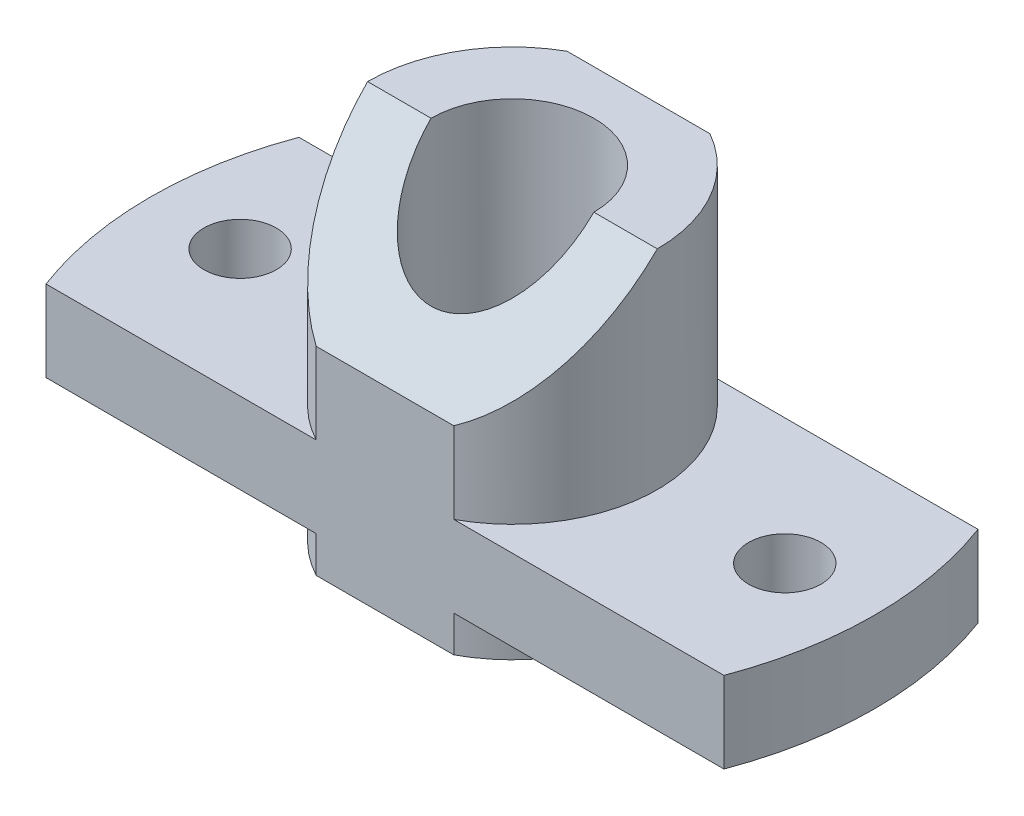
ISO-10303-21;
HEADER;
FILE_DESCRIPTION(('STEP AP214'),'2;1');
FILE_NAME('part.step','',(''),(''),'','','');
FILE_SCHEMA(('AUTOMOTIVE_DESIGN { 1 0 10303 214 1 1 1 1 }'));
ENDSEC;
DATA;
#1=APPLICATION_CONTEXT('core data for automotive mechanical design processes');
#2=APPLICATION_PROTOCOL_DEFINITION('international standard','automotive_design',2000,#1);
#3=PRODUCT_CONTEXT('',#1,'mechanical');
#4=PRODUCT('Part','Part','',(#3));
#5=PRODUCT_RELATED_PRODUCT_CATEGORY('part','',(#4));
#6=PRODUCT_DEFINITION_FORMATION('','',#4);
#7=PRODUCT_DEFINITION_CONTEXT('part definition',#1,'design');
#8=PRODUCT_DEFINITION('design','',#6,#7);
#9=PRODUCT_DEFINITION_SHAPE('','',#8);
#10=(LENGTH_UNIT() NAMED_UNIT(*) SI_UNIT(.MILLI.,.METRE.));
#11=(NAMED_UNIT(*) PLANE_ANGLE_UNIT() SI_UNIT($,.RADIAN.));
#12=(NAMED_UNIT(*) SI_UNIT($,.STERADIAN.) SOLID_ANGLE_UNIT());
#13=UNCERTAINTY_MEASURE_WITH_UNIT(LENGTH_MEASURE(1.E-05),#10,'distance_accuracy_value','');
#14=(GEOMETRIC_REPRESENTATION_CONTEXT(3) GLOBAL_UNCERTAINTY_ASSIGNED_CONTEXT((#13)) GLOBAL_UNIT_ASSIGNED_CONTEXT((#10,
#11,#12)) REPRESENTATION_CONTEXT('',''));
#15=CARTESIAN_POINT('',(0.,0.,0.));
#16=DIRECTION('',(0.,0.,1.));
#17=DIRECTION('',(1.,0.,0.));
#18=AXIS2_PLACEMENT_3D('',#15,#16,#17);
#19=CARTESIAN_POINT('',(0.,57.15,0.));
#20=DIRECTION('',(0.,-1.,0.));
#21=DIRECTION('',(1.,0.,0.));
#22=AXIS2_PLACEMENT_3D('',#19,#20,#21);
#23=PLANE('',#22);
#24=CARTESIAN_POINT('',(0.,57.15,0.));
#25=DIRECTION('',(0.,-1.,0.));
#26=DIRECTION('',(1.,0.,0.));
#27=AXIS2_PLACEMENT_3D('',#24,#25,#26);
#28=CIRCLE('',#27,25.4);
#29=CARTESIAN_POINT('',(-25.4,57.15,-1.59594559789866E-13));
#30=VERTEX_POINT('',#29);
#31=CARTESIAN_POINT('',(-12.523513724191,57.15,-22.098));
#32=VERTEX_POINT('',#31);
#33=EDGE_CURVE('E146',#30,#32,#28,.T.);
#34=ORIENTED_EDGE('',*,*,#33,.F.);
#35=DIRECTION('',(1.,0.,0.));
#36=VECTOR('',#35,1.);
#37=CARTESIAN_POINT('',(0.,57.15,-1.59594559789866E-13));
#38=LINE('',#37,#36);
#39=CARTESIAN_POINT('',(-14.2748,57.15,-1.59594559789866E-13));
#40=VERTEX_POINT('',#39);
#41=EDGE_CURVE('E62',#30,#40,#38,.T.);
#42=ORIENTED_EDGE('',*,*,#41,.T.);
#43=CARTESIAN_POINT('',(0.,57.15,0.));
#44=DIRECTION('',(0.,1.,0.));
#45=DIRECTION('',(0.,0.,1.));
#46=AXIS2_PLACEMENT_3D('',#43,#44,#45);
#47=CIRCLE('',#46,14.2748);
#48=CARTESIAN_POINT('',(14.2748,57.15,-1.59594559789866E-13));
#49=VERTEX_POINT('',#48);
#50=EDGE_CURVE('E181',#49,#40,#47,.T.);
#51=ORIENTED_EDGE('',*,*,#50,.F.);
#52=DIRECTION('',(1.,0.,0.));
#53=VECTOR('',#52,1.);
#54=CARTESIAN_POINT('',(0.,57.15,-1.59594559789866E-13));
#55=LINE('',#54,#53);
#56=CARTESIAN_POINT('',(25.4,57.15,-1.59594559789866E-13));
#57=VERTEX_POINT('',#56);
#58=EDGE_CURVE('E273',#49,#57,#55,.T.);
#59=ORIENTED_EDGE('',*,*,#58,.T.);
#60=CARTESIAN_POINT('',(12.523513724191,57.15,-22.098));
#61=VERTEX_POINT('',#60);
#62=EDGE_CURVE('E157',#61,#57,#28,.T.);
#63=ORIENTED_EDGE('',*,*,#62,.F.);
#64=DIRECTION('',(1.,0.,0.));
#65=VECTOR('',#64,1.);
#66=CARTESIAN_POINT('',(-59.5309028656546,57.15,-22.098));
#67=LINE('',#66,#65);
#68=EDGE_CURVE('E161',#32,#61,#67,.T.);
#69=ORIENTED_EDGE('',*,*,#68,.F.);
#70=EDGE_LOOP('',(#34,#42,#51,#59,#63,#69));
#71=FACE_BOUND('',#70,.T.);
#72=ADVANCED_FACE('F45',(#71),#23,.F.);
#73=CARTESIAN_POINT('',(-25.4,20.574,0.));
#74=DIRECTION('',(0.,-1.,0.));
#75=DIRECTION('',(1.,0.,0.));
#76=AXIS2_PLACEMENT_3D('',#73,#74,#75);
#77=PLANE('',#76);
#78=CARTESIAN_POINT('',(47.752,20.574,0.));
#79=DIRECTION('',(0.,1.,0.));
#80=DIRECTION('',(0.,0.,1.));
#81=AXIS2_PLACEMENT_3D('',#78,#79,#80);
#82=CIRCLE('',#81,6.35);
#83=CARTESIAN_POINT('',(47.752,20.574,6.35));
#84=VERTEX_POINT('',#83);
#85=EDGE_CURVE('E339',#84,#84,#82,.T.);
#86=ORIENTED_EDGE('',*,*,#85,.F.);
#87=EDGE_LOOP('',(#86));
#88=FACE_BOUND('',#87,.T.);
#89=CARTESIAN_POINT('',(0.,20.574,0.));
#90=DIRECTION('',(0.,-1.,0.));
#91=DIRECTION('',(1.,0.,0.));
#92=AXIS2_PLACEMENT_3D('',#89,#90,#91);
#93=CIRCLE('',#92,63.5);
#94=CARTESIAN_POINT('',(59.5309028656546,20.574,-22.098));
#95=VERTEX_POINT('',#94);
#96=CARTESIAN_POINT('',(59.436,20.574,22.352));
#97=VERTEX_POINT('',#96);
#98=EDGE_CURVE('E255',#95,#97,#93,.T.);
#99=ORIENTED_EDGE('',*,*,#98,.F.);
#100=DIRECTION('',(-1.,0.,0.));
#101=VECTOR('',#100,1.);
#102=CARTESIAN_POINT('',(-25.4,20.574,-22.098));
#103=LINE('',#102,#101);
#104=CARTESIAN_POINT('',(12.523513724191,20.574,-22.098));
#105=VERTEX_POINT('',#104);
#106=EDGE_CURVE('E188',#95,#105,#103,.T.);
#107=ORIENTED_EDGE('',*,*,#106,.T.);
#108=CARTESIAN_POINT('',(0.,20.574,0.));
#109=DIRECTION('',(0.,-1.,0.));
#110=DIRECTION('',(1.,0.,0.));
#111=AXIS2_PLACEMENT_3D('',#108,#109,#110);
#112=CIRCLE('',#111,25.4);
#113=CARTESIAN_POINT('',(12.0643315604305,20.574,22.352));
#114=VERTEX_POINT('',#113);
#115=EDGE_CURVE('E239',#105,#114,#112,.T.);
#116=ORIENTED_EDGE('',*,*,#115,.T.);
#117=DIRECTION('',(1.,0.,0.));
#118=VECTOR('',#117,1.);
#119=CARTESIAN_POINT('',(-25.4,20.574,22.352));
#120=LINE('',#119,#118);
#121=EDGE_CURVE('E223',#114,#97,#120,.T.);
#122=ORIENTED_EDGE('',*,*,#121,.T.);
#123=EDGE_LOOP('',(#99,#107,#116,#122));
#124=FACE_BOUND('',#123,.T.);
#125=ADVANCED_FACE('F326',(#88,#124),#77,.F.);
#126=CARTESIAN_POINT('',(0.,0.,0.));
#127=DIRECTION('',(0.,-1.,0.));
#128=DIRECTION('',(1.,0.,0.));
#129=AXIS2_PLACEMENT_3D('',#126,#127,#128);
#130=CYLINDRICAL_SURFACE('',#129,63.5);
#131=CARTESIAN_POINT('',(-59.436,20.574,22.352));
#132=VERTEX_POINT('',#131);
#133=CARTESIAN_POINT('',(-59.5309028656546,20.574,-22.098));
#134=VERTEX_POINT('',#133);
#135=EDGE_CURVE('E256',#132,#134,#93,.T.);
#136=ORIENTED_EDGE('',*,*,#135,.T.);
#137=DIRECTION('',(0.,1.,0.));
#138=VECTOR('',#137,1.);
#139=CARTESIAN_POINT('',(-59.5309028656546,0.,-22.098));
#140=LINE('',#139,#138);
#141=CARTESIAN_POINT('',(-59.5309028656546,6.35000000000002,-22.098));
#142=VERTEX_POINT('',#141);
#143=EDGE_CURVE('E178',#142,#134,#140,.T.);
#144=ORIENTED_EDGE('',*,*,#143,.F.);
#145=CARTESIAN_POINT('',(0.,6.35000000000003,0.));
#146=DIRECTION('',(0.,-1.,0.));
#147=DIRECTION('',(1.,0.,0.));
#148=AXIS2_PLACEMENT_3D('',#145,#146,#147);
#149=CIRCLE('',#148,63.5);
#150=CARTESIAN_POINT('',(-59.436,6.35000000000002,22.352));
#151=VERTEX_POINT('',#150);
#152=EDGE_CURVE('E251',#151,#142,#149,.T.);
#153=ORIENTED_EDGE('',*,*,#152,.F.);
#154=DIRECTION('',(0.,1.,0.));
#155=VECTOR('',#154,1.);
#156=CARTESIAN_POINT('',(-59.436,0.,22.352));
#157=LINE('',#156,#155);
#158=EDGE_CURVE('E212',#151,#132,#157,.T.);
#159=ORIENTED_EDGE('',*,*,#158,.T.);
#160=EDGE_LOOP('',(#136,#144,#153,#159));
#161=FACE_BOUND('',#160,.T.);
#162=ADVANCED_FACE('F297',(#161),#130,.T.);
#163=CARTESIAN_POINT('',(-63.5,6.35000000000002,0.));
#164=DIRECTION('',(0.,1.,0.));
#165=DIRECTION('',(-1.,0.,0.));
#166=AXIS2_PLACEMENT_3D('',#163,#164,#165);
#167=PLANE('',#166);
#168=CARTESIAN_POINT('',(-47.752,6.35000000000002,0.));
#169=DIRECTION('',(0.,1.,0.));
#170=DIRECTION('',(-1.,0.,0.));
#171=AXIS2_PLACEMENT_3D('',#168,#169,#170);
#172=CIRCLE('',#171,6.35);
#173=CARTESIAN_POINT('',(-54.102,6.35000000000002,0.));
#174=VERTEX_POINT('',#173);
#175=EDGE_CURVE('E345',#174,#174,#172,.T.);
#176=ORIENTED_EDGE('',*,*,#175,.T.);
#177=EDGE_LOOP('',(#176));
#178=FACE_BOUND('',#177,.T.);
#179=ORIENTED_EDGE('',*,*,#152,.T.);
#180=DIRECTION('',(1.,0.,0.));
#181=VECTOR('',#180,1.);
#182=CARTESIAN_POINT('',(-63.5,6.35000000000002,-22.098));
#183=LINE('',#182,#181);
#184=CARTESIAN_POINT('',(-12.523513724191,6.35000000000001,-22.098));
#185=VERTEX_POINT('',#184);
#186=EDGE_CURVE('E203',#142,#185,#183,.T.);
#187=ORIENTED_EDGE('',*,*,#186,.T.);
#188=CARTESIAN_POINT('',(0.,6.35000000000001,0.));
#189=DIRECTION('',(0.,-1.,0.));
#190=DIRECTION('',(1.,0.,0.));
#191=AXIS2_PLACEMENT_3D('',#188,#189,#190);
#192=CIRCLE('',#191,25.4);
#193=CARTESIAN_POINT('',(-12.0643315604305,6.35000000000001,22.352));
#194=VERTEX_POINT('',#193);
#195=EDGE_CURVE('E246',#194,#185,#192,.T.);
#196=ORIENTED_EDGE('',*,*,#195,.F.);
#197=DIRECTION('',(-1.,0.,0.));
#198=VECTOR('',#197,1.);
#199=CARTESIAN_POINT('',(-63.5,6.35000000000002,22.352));
#200=LINE('',#199,#198);
#201=EDGE_CURVE('E228',#194,#151,#200,.T.);
#202=ORIENTED_EDGE('',*,*,#201,.T.);
#203=EDGE_LOOP('',(#179,#187,#196,#202));
#204=FACE_BOUND('',#203,.T.);
#205=ADVANCED_FACE('F304',(#178,#204),#167,.F.);
#206=CARTESIAN_POINT('',(0.,0.,0.));
#207=DIRECTION('',(0.,-1.,0.));
#208=DIRECTION('',(1.,0.,0.));
#209=AXIS2_PLACEMENT_3D('',#206,#207,#208);
#210=CYLINDRICAL_SURFACE('',#209,25.4);
#211=ORIENTED_EDGE('',*,*,#195,.T.);
#212=DIRECTION('',(0.,-1.,0.));
#213=VECTOR('',#212,1.);
#214=CARTESIAN_POINT('',(-12.523513724191,0.,-22.098));
#215=LINE('',#214,#213);
#216=CARTESIAN_POINT('',(-12.523513724191,0.,-22.098));
#217=VERTEX_POINT('',#216);
#218=EDGE_CURVE('E202',#185,#217,#215,.T.);
#219=ORIENTED_EDGE('',*,*,#218,.T.);
#220=CARTESIAN_POINT('',(0.,0.,0.));
#221=DIRECTION('',(0.,-1.,0.));
#222=DIRECTION('',(1.,0.,0.));
#223=AXIS2_PLACEMENT_3D('',#220,#221,#222);
#224=CIRCLE('',#223,25.4);
#225=CARTESIAN_POINT('',(-12.0643315604305,0.,22.352));
#226=VERTEX_POINT('',#225);
#227=EDGE_CURVE('E241',#226,#217,#224,.T.);
#228=ORIENTED_EDGE('',*,*,#227,.F.);
#229=DIRECTION('',(0.,-1.,0.));
#230=VECTOR('',#229,1.);
#231=CARTESIAN_POINT('',(-12.0643315604305,0.,22.352));
#232=LINE('',#231,#230);
#233=EDGE_CURVE('E224',#226,#194,#232,.F.);
#234=ORIENTED_EDGE('',*,*,#233,.T.);
#235=EDGE_LOOP('',(#211,#219,#228,#234));
#236=FACE_BOUND('',#235,.T.);
#237=ADVANCED_FACE('F306',(#236),#210,.T.);
#238=CARTESIAN_POINT('',(0.,0.,0.));
#239=DIRECTION('',(0.,-1.,0.));
#240=DIRECTION('',(1.,0.,0.));
#241=AXIS2_PLACEMENT_3D('',#238,#239,#240);
#242=CYLINDRICAL_SURFACE('',#241,25.4);
#243=DIRECTION('',(0.,-1.,0.));
#244=VECTOR('',#243,1.);
#245=CARTESIAN_POINT('',(-12.0643315604305,0.,22.352));
#246=LINE('',#245,#244);
#247=CARTESIAN_POINT('',(-12.0643315604305,20.574,22.352));
#248=VERTEX_POINT('',#247);
#249=CARTESIAN_POINT('',(-12.0643315604305,34.7979999999996,22.352));
#250=VERTEX_POINT('',#249);
#251=EDGE_CURVE('E260',#248,#250,#246,.F.);
#252=ORIENTED_EDGE('',*,*,#251,.T.);
#253=CARTESIAN_POINT('',(0.,57.1499999999998,0.));
#254=DIRECTION('',(0.,-0.707106781186544,-0.707106781186551));
#255=DIRECTION('',(0.,-0.707106781186551,0.707106781186544));
#256=AXIS2_PLACEMENT_3D('',#253,#254,#255);
#257=ELLIPSE('',#256,35.9210244842768,25.4);
#258=EDGE_CURVE('E153',#250,#30,#257,.T.);
#259=ORIENTED_EDGE('',*,*,#258,.T.);
#260=ORIENTED_EDGE('',*,*,#33,.T.);
#261=DIRECTION('',(0.,-1.,0.));
#262=VECTOR('',#261,1.);
#263=CARTESIAN_POINT('',(-12.523513724191,0.,-22.098));
#264=LINE('',#263,#262);
#265=CARTESIAN_POINT('',(-12.523513724191,20.574,-22.098));
#266=VERTEX_POINT('',#265);
#267=EDGE_CURVE('E151',#32,#266,#264,.T.);
#268=ORIENTED_EDGE('',*,*,#267,.T.);
#269=EDGE_CURVE('E237',#248,#266,#112,.T.);
#270=ORIENTED_EDGE('',*,*,#269,.F.);
#271=EDGE_LOOP('',(#252,#259,#260,#268,#270));
#272=FACE_BOUND('',#271,.T.);
#273=ADVANCED_FACE('F149',(#272),#242,.T.);
#274=CARTESIAN_POINT('',(-47.752,20.574,0.));
#275=DIRECTION('',(0.,1.,0.));
#276=DIRECTION('',(0.,0.,1.));
#277=AXIS2_PLACEMENT_3D('',#274,#275,#276);
#278=CIRCLE('',#277,6.35);
#279=CARTESIAN_POINT('',(-47.752,20.574,6.35));
#280=VERTEX_POINT('',#279);
#281=EDGE_CURVE('E349',#280,#280,#278,.T.);
#282=ORIENTED_EDGE('',*,*,#281,.F.);
#283=EDGE_LOOP('',(#282));
#284=FACE_BOUND('',#283,.T.);
#285=ORIENTED_EDGE('',*,*,#269,.T.);
#286=EDGE_CURVE('E164',#266,#134,#103,.T.);
#287=ORIENTED_EDGE('',*,*,#286,.T.);
#288=ORIENTED_EDGE('',*,*,#135,.F.);
#289=EDGE_CURVE('E216',#132,#248,#120,.T.);
#290=ORIENTED_EDGE('',*,*,#289,.T.);
#291=EDGE_LOOP('',(#285,#287,#288,#290));
#292=FACE_BOUND('',#291,.T.);
#293=ADVANCED_FACE('F294',(#284,#292),#77,.F.);
#294=CARTESIAN_POINT('',(59.5309028656546,6.35000000000002,-22.098));
#295=VERTEX_POINT('',#294);
#296=CARTESIAN_POINT('',(59.436,6.35000000000002,22.352));
#297=VERTEX_POINT('',#296);
#298=EDGE_CURVE('E250',#295,#297,#149,.T.);
#299=ORIENTED_EDGE('',*,*,#298,.F.);
#300=DIRECTION('',(0.,1.,0.));
#301=VECTOR('',#300,1.);
#302=CARTESIAN_POINT('',(59.5309028656546,0.,-22.098));
#303=LINE('',#302,#301);
#304=EDGE_CURVE('E184',#295,#95,#303,.T.);
#305=ORIENTED_EDGE('',*,*,#304,.T.);
#306=ORIENTED_EDGE('',*,*,#98,.T.);
#307=DIRECTION('',(0.,1.,0.));
#308=VECTOR('',#307,1.);
#309=CARTESIAN_POINT('',(59.436,0.,22.352));
#310=LINE('',#309,#308);
#311=EDGE_CURVE('E211',#297,#97,#310,.T.);
#312=ORIENTED_EDGE('',*,*,#311,.F.);
#313=EDGE_LOOP('',(#299,#305,#306,#312));
#314=FACE_BOUND('',#313,.T.);
#315=ADVANCED_FACE('F322',(#314),#130,.T.);
#316=CARTESIAN_POINT('',(47.752,6.35000000000002,0.));
#317=DIRECTION('',(0.,1.,0.));
#318=DIRECTION('',(-1.,0.,0.));
#319=AXIS2_PLACEMENT_3D('',#316,#317,#318);
#320=CIRCLE('',#319,6.35);
#321=CARTESIAN_POINT('',(41.402,6.35000000000002,0.));
#322=VERTEX_POINT('',#321);
#323=EDGE_CURVE('E335',#322,#322,#320,.T.);
#324=ORIENTED_EDGE('',*,*,#323,.T.);
#325=EDGE_LOOP('',(#324));
#326=FACE_BOUND('',#325,.T.);
#327=CARTESIAN_POINT('',(12.523513724191,6.35000000000001,-22.098));
#328=VERTEX_POINT('',#327);
#329=CARTESIAN_POINT('',(12.0643315604305,6.35000000000001,22.352));
#330=VERTEX_POINT('',#329);
#331=EDGE_CURVE('E245',#328,#330,#192,.T.);
#332=ORIENTED_EDGE('',*,*,#331,.F.);
#333=EDGE_CURVE('E198',#328,#295,#183,.T.);
#334=ORIENTED_EDGE('',*,*,#333,.T.);
#335=ORIENTED_EDGE('',*,*,#298,.T.);
#336=EDGE_CURVE('E233',#297,#330,#200,.T.);
#337=ORIENTED_EDGE('',*,*,#336,.T.);
#338=EDGE_LOOP('',(#332,#334,#335,#337));
#339=FACE_BOUND('',#338,.T.);
#340=ADVANCED_FACE('F319',(#326,#339),#167,.F.);
#341=CARTESIAN_POINT('',(12.523513724191,0.,-22.098));
#342=VERTEX_POINT('',#341);
#343=CARTESIAN_POINT('',(12.0643315604305,0.,22.352));
#344=VERTEX_POINT('',#343);
#345=EDGE_CURVE('E156',#342,#344,#224,.T.);
#346=ORIENTED_EDGE('',*,*,#345,.F.);
#347=DIRECTION('',(0.,-1.,0.));
#348=VECTOR('',#347,1.);
#349=CARTESIAN_POINT('',(12.523513724191,0.,-22.098));
#350=LINE('',#349,#348);
#351=EDGE_CURVE('E194',#342,#328,#350,.F.);
#352=ORIENTED_EDGE('',*,*,#351,.T.);
#353=ORIENTED_EDGE('',*,*,#331,.T.);
#354=DIRECTION('',(0.,-1.,0.));
#355=VECTOR('',#354,1.);
#356=CARTESIAN_POINT('',(12.0643315604305,0.,22.352));
#357=LINE('',#356,#355);
#358=EDGE_CURVE('E232',#330,#344,#357,.T.);
#359=ORIENTED_EDGE('',*,*,#358,.T.);
#360=EDGE_LOOP('',(#346,#352,#353,#359));
#361=FACE_BOUND('',#360,.T.);
#362=ADVANCED_FACE('F314',(#361),#210,.T.);
#363=CARTESIAN_POINT('',(-25.4,0.,0.));
#364=DIRECTION('',(0.,1.,0.));
#365=DIRECTION('',(-1.,0.,0.));
#366=AXIS2_PLACEMENT_3D('',#363,#364,#365);
#367=PLANE('',#366);
#368=CARTESIAN_POINT('',(0.,0.,0.));
#369=DIRECTION('',(0.,1.,0.));
#370=DIRECTION('',(0.,0.,1.));
#371=AXIS2_PLACEMENT_3D('',#368,#369,#370);
#372=CIRCLE('',#371,14.2748);
#373=CARTESIAN_POINT('',(0.,0.,14.2748));
#374=VERTEX_POINT('',#373);
#375=EDGE_CURVE('E173',#374,#374,#372,.T.);
#376=ORIENTED_EDGE('',*,*,#375,.T.);
#377=EDGE_LOOP('',(#376));
#378=FACE_BOUND('',#377,.T.);
#379=ORIENTED_EDGE('',*,*,#227,.T.);
#380=DIRECTION('',(1.,0.,0.));
#381=VECTOR('',#380,1.);
#382=CARTESIAN_POINT('',(-59.5309028656546,0.,-22.098));
#383=LINE('',#382,#381);
#384=EDGE_CURVE('E172',#217,#342,#383,.T.);
#385=ORIENTED_EDGE('',*,*,#384,.T.);
#386=ORIENTED_EDGE('',*,*,#345,.T.);
#387=DIRECTION('',(-1.,0.,0.));
#388=VECTOR('',#387,1.);
#389=CARTESIAN_POINT('',(-59.436,0.,22.352));
#390=LINE('',#389,#388);
#391=EDGE_CURVE('E207',#344,#226,#390,.T.);
#392=ORIENTED_EDGE('',*,*,#391,.T.);
#393=EDGE_LOOP('',(#379,#385,#386,#392));
#394=FACE_BOUND('',#393,.T.);
#395=ADVANCED_FACE('F311',(#378,#394),#367,.F.);
#396=ORIENTED_EDGE('',*,*,#62,.T.);
#397=CARTESIAN_POINT('',(0.,57.1499999999998,0.));
#398=DIRECTION('',(0.,-0.707106781186544,-0.707106781186551));
#399=DIRECTION('',(0.,-0.707106781186551,0.707106781186544));
#400=AXIS2_PLACEMENT_3D('',#397,#398,#399);
#401=ELLIPSE('',#400,35.9210244842768,25.4);
#402=CARTESIAN_POINT('',(12.0643315604305,34.7979999999996,22.352));
#403=VERTEX_POINT('',#402);
#404=EDGE_CURVE('E11',#57,#403,#401,.T.);
#405=ORIENTED_EDGE('',*,*,#404,.T.);
#406=DIRECTION('',(0.,-1.,0.));
#407=VECTOR('',#406,1.);
#408=CARTESIAN_POINT('',(12.0643315604305,0.,22.352));
#409=LINE('',#408,#407);
#410=EDGE_CURVE('E263',#403,#114,#409,.T.);
#411=ORIENTED_EDGE('',*,*,#410,.T.);
#412=ORIENTED_EDGE('',*,*,#115,.F.);
#413=DIRECTION('',(0.,-1.,0.));
#414=VECTOR('',#413,1.);
#415=CARTESIAN_POINT('',(12.523513724191,0.,-22.098));
#416=LINE('',#415,#414);
#417=EDGE_CURVE('E167',#105,#61,#416,.F.);
#418=ORIENTED_EDGE('',*,*,#417,.T.);
#419=EDGE_LOOP('',(#396,#405,#411,#412,#418));
#420=FACE_BOUND('',#419,.T.);
#421=ADVANCED_FACE('F329',(#420),#242,.T.);
#422=CARTESIAN_POINT('',(-59.436,0.,22.352));
#423=DIRECTION('',(0.,0.,-1.));
#424=DIRECTION('',(-1.,0.,0.));
#425=AXIS2_PLACEMENT_3D('',#422,#423,#424);
#426=PLANE('',#425);
#427=ORIENTED_EDGE('',*,*,#410,.F.);
#428=DIRECTION('',(-1.,0.,0.));
#429=VECTOR('',#428,1.);
#430=CARTESIAN_POINT('',(-59.436,34.7979999999996,22.352));
#431=LINE('',#430,#429);
#432=EDGE_CURVE('E166',#403,#250,#431,.T.);
#433=ORIENTED_EDGE('',*,*,#432,.T.);
#434=ORIENTED_EDGE('',*,*,#251,.F.);
#435=ORIENTED_EDGE('',*,*,#289,.F.);
#436=ORIENTED_EDGE('',*,*,#158,.F.);
#437=ORIENTED_EDGE('',*,*,#201,.F.);
#438=ORIENTED_EDGE('',*,*,#233,.F.);
#439=ORIENTED_EDGE('',*,*,#391,.F.);
#440=ORIENTED_EDGE('',*,*,#358,.F.);
#441=ORIENTED_EDGE('',*,*,#336,.F.);
#442=ORIENTED_EDGE('',*,*,#311,.T.);
#443=ORIENTED_EDGE('',*,*,#121,.F.);
#444=EDGE_LOOP('',(#427,#433,#434,#435,#436,#437,#438,#439,#440,#441,#442,#443));
#445=FACE_BOUND('',#444,.T.);
#446=ADVANCED_FACE('F301',(#445),#426,.F.);
#447=CARTESIAN_POINT('',(-59.5309028656546,0.,-22.098));
#448=DIRECTION('',(0.,0.,1.));
#449=DIRECTION('',(1.,0.,0.));
#450=AXIS2_PLACEMENT_3D('',#447,#448,#449);
#451=PLANE('',#450);
#452=ORIENTED_EDGE('',*,*,#143,.T.);
#453=ORIENTED_EDGE('',*,*,#286,.F.);
#454=ORIENTED_EDGE('',*,*,#267,.F.);
#455=ORIENTED_EDGE('',*,*,#68,.T.);
#456=ORIENTED_EDGE('',*,*,#417,.F.);
#457=ORIENTED_EDGE('',*,*,#106,.F.);
#458=ORIENTED_EDGE('',*,*,#304,.F.);
#459=ORIENTED_EDGE('',*,*,#333,.F.);
#460=ORIENTED_EDGE('',*,*,#351,.F.);
#461=ORIENTED_EDGE('',*,*,#384,.F.);
#462=ORIENTED_EDGE('',*,*,#218,.F.);
#463=ORIENTED_EDGE('',*,*,#186,.F.);
#464=EDGE_LOOP('',(#452,#453,#454,#455,#456,#457,#458,#459,#460,#461,#462,#463));
#465=FACE_BOUND('',#464,.T.);
#466=ADVANCED_FACE('F160',(#465),#451,.F.);
#467=CARTESIAN_POINT('',(0.,57.15,0.));
#468=DIRECTION('',(0.,1.,0.));
#469=DIRECTION('',(0.,0.,1.));
#470=AXIS2_PLACEMENT_3D('',#467,#468,#469);
#471=CYLINDRICAL_SURFACE('',#470,14.2748);
#472=ORIENTED_EDGE('',*,*,#375,.F.);
#473=EDGE_LOOP('',(#472));
#474=FACE_BOUND('',#473,.T.);
#475=ORIENTED_EDGE('',*,*,#50,.T.);
#476=CARTESIAN_POINT('',(0.,57.1499999999998,0.));
#477=DIRECTION('',(0.,-0.707106781186544,-0.707106781186551));
#478=DIRECTION('',(0.,0.707106781186551,-0.707106781186544));
#479=AXIS2_PLACEMENT_3D('',#476,#477,#478);
#480=ELLIPSE('',#479,20.1876157601636,14.2748);
#481=EDGE_CURVE('E55',#40,#49,#480,.F.);
#482=ORIENTED_EDGE('',*,*,#481,.T.);
#483=EDGE_LOOP('',(#475,#482));
#484=FACE_BOUND('',#483,.T.);
#485=ADVANCED_FACE('F395',(#474,#484),#471,.F.);
#486=CARTESIAN_POINT('',(47.752,20.574,0.));
#487=DIRECTION('',(0.,1.,0.));
#488=DIRECTION('',(0.,0.,1.));
#489=AXIS2_PLACEMENT_3D('',#486,#487,#488);
#490=CYLINDRICAL_SURFACE('',#489,6.35);
#491=ORIENTED_EDGE('',*,*,#85,.T.);
#492=EDGE_LOOP('',(#491));
#493=FACE_BOUND('',#492,.T.);
#494=ORIENTED_EDGE('',*,*,#323,.F.);
#495=EDGE_LOOP('',(#494));
#496=FACE_BOUND('',#495,.T.);
#497=ADVANCED_FACE('F389',(#493,#496),#490,.F.);
#498=CARTESIAN_POINT('',(-47.752,20.574,0.));
#499=DIRECTION('',(0.,1.,0.));
#500=DIRECTION('',(0.,0.,1.));
#501=AXIS2_PLACEMENT_3D('',#498,#499,#500);
#502=CYLINDRICAL_SURFACE('',#501,6.35);
#503=ORIENTED_EDGE('',*,*,#281,.T.);
#504=EDGE_LOOP('',(#503));
#505=FACE_BOUND('',#504,.T.);
#506=ORIENTED_EDGE('',*,*,#175,.F.);
#507=EDGE_LOOP('',(#506));
#508=FACE_BOUND('',#507,.T.);
#509=ADVANCED_FACE('F354',(#505,#508),#502,.F.);
#510=CARTESIAN_POINT('',(-59.436,34.7979999999996,22.352));
#511=DIRECTION('',(0.,-0.707106781186544,-0.707106781186551));
#512=DIRECTION('',(-1.,0.,0.));
#513=AXIS2_PLACEMENT_3D('',#510,#511,#512);
#514=PLANE('',#513);
#515=ORIENTED_EDGE('',*,*,#481,.F.);
#516=ORIENTED_EDGE('',*,*,#41,.F.);
#517=ORIENTED_EDGE('',*,*,#258,.F.);
#518=ORIENTED_EDGE('',*,*,#432,.F.);
#519=ORIENTED_EDGE('',*,*,#404,.F.);
#520=ORIENTED_EDGE('',*,*,#58,.F.);
#521=EDGE_LOOP('',(#515,#516,#517,#518,#519,#520));
#522=FACE_BOUND('',#521,.T.);
#523=ADVANCED_FACE('F48',(#522),#514,.F.);
#524=CLOSED_SHELL('',(#72,#125,#162,#205,#237,#273,#293,#315,#340,#362,#395,#421,#446,#466,#485,
#497,#509,#523));
#525=MANIFOLD_SOLID_BREP('B2',#524);
#526=ADVANCED_BREP_SHAPE_REPRESENTATION('',(#18,#525),#14);
#527=SHAPE_DEFINITION_REPRESENTATION(#9,#526);
ENDSEC;
END-ISO-10303-21;
